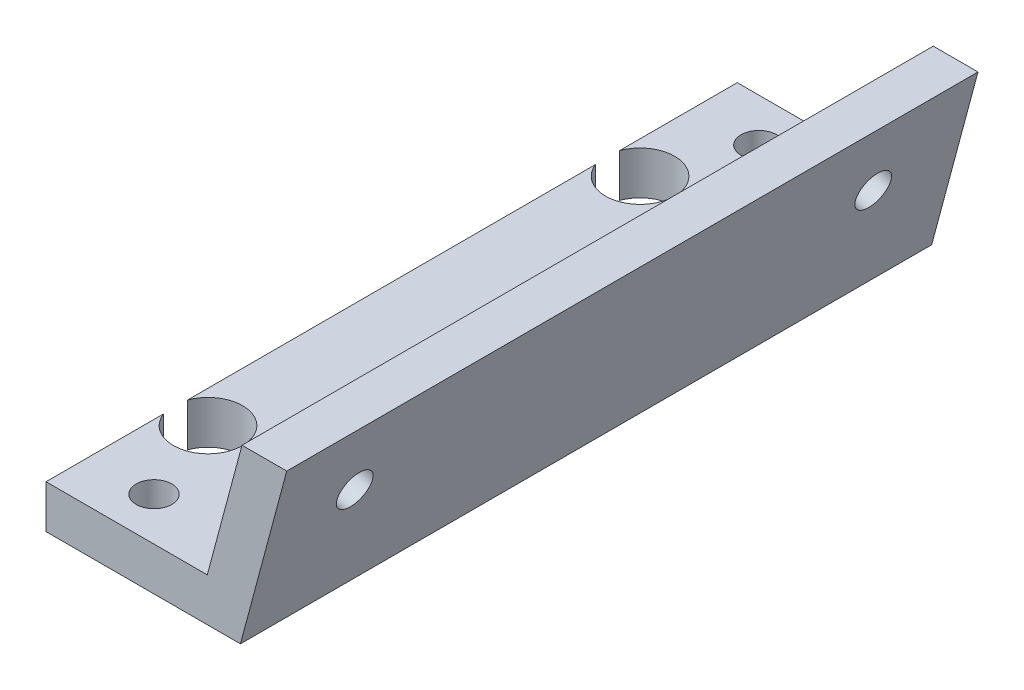
ISO-10303-21;
HEADER;
FILE_DESCRIPTION(('STEP AP214'),'2;1');
FILE_NAME('part.step','',(''),(''),'','','');
FILE_SCHEMA(('AUTOMOTIVE_DESIGN { 1 0 10303 214 1 1 1 1 }'));
ENDSEC;
DATA;
#1=APPLICATION_CONTEXT('core data for automotive mechanical design processes');
#2=APPLICATION_PROTOCOL_DEFINITION('international standard','automotive_design',2000,#1);
#3=PRODUCT_CONTEXT('',#1,'mechanical');
#4=PRODUCT('Part','Part','',(#3));
#5=PRODUCT_RELATED_PRODUCT_CATEGORY('part','',(#4));
#6=PRODUCT_DEFINITION_FORMATION('','',#4);
#7=PRODUCT_DEFINITION_CONTEXT('part definition',#1,'design');
#8=PRODUCT_DEFINITION('design','',#6,#7);
#9=PRODUCT_DEFINITION_SHAPE('','',#8);
#10=(LENGTH_UNIT() NAMED_UNIT(*) SI_UNIT(.MILLI.,.METRE.));
#11=(NAMED_UNIT(*) PLANE_ANGLE_UNIT() SI_UNIT($,.RADIAN.));
#12=(NAMED_UNIT(*) SI_UNIT($,.STERADIAN.) SOLID_ANGLE_UNIT());
#13=UNCERTAINTY_MEASURE_WITH_UNIT(LENGTH_MEASURE(1.E-05),#10,'distance_accuracy_value','');
#14=(GEOMETRIC_REPRESENTATION_CONTEXT(3) GLOBAL_UNCERTAINTY_ASSIGNED_CONTEXT((#13)) GLOBAL_UNIT_ASSIGNED_CONTEXT((#10,
#11,#12)) REPRESENTATION_CONTEXT('',''));
#15=CARTESIAN_POINT('',(0.,0.,0.));
#16=DIRECTION('',(0.,0.,1.));
#17=DIRECTION('',(1.,0.,0.));
#18=AXIS2_PLACEMENT_3D('',#15,#16,#17);
#19=CARTESIAN_POINT('',(-18.,4.,32.));
#20=DIRECTION('',(1.,0.,0.));
#21=DIRECTION('',(0.,0.,-1.));
#22=AXIS2_PLACEMENT_3D('',#19,#20,#21);
#23=PLANE('',#22);
#24=DIRECTION('',(0.,0.,-1.));
#25=VECTOR('',#24,1.);
#26=CARTESIAN_POINT('',(-18.,0.,32.));
#27=LINE('',#26,#25);
#28=CARTESIAN_POINT('',(-18.,0.,18.886447127434));
#29=VERTEX_POINT('',#28);
#30=CARTESIAN_POINT('',(-18.,0.,-18.886447127434));
#31=VERTEX_POINT('',#30);
#32=EDGE_CURVE('E125',#29,#31,#27,.T.);
#33=ORIENTED_EDGE('',*,*,#32,.F.);
#34=DIRECTION('',(0.,1.,0.));
#35=VECTOR('',#34,1.);
#36=CARTESIAN_POINT('',(-18.,-100.,18.886447127434));
#37=LINE('',#36,#35);
#38=CARTESIAN_POINT('',(-18.,4.,18.886447127434));
#39=VERTEX_POINT('',#38);
#40=EDGE_CURVE('E119',#29,#39,#37,.T.);
#41=ORIENTED_EDGE('',*,*,#40,.T.);
#42=DIRECTION('',(0.,0.,-1.));
#43=VECTOR('',#42,1.);
#44=CARTESIAN_POINT('',(-18.,4.,32.));
#45=LINE('',#44,#43);
#46=CARTESIAN_POINT('',(-18.,4.,-18.886447127434));
#47=VERTEX_POINT('',#46);
#48=EDGE_CURVE('E65',#39,#47,#45,.T.);
#49=ORIENTED_EDGE('',*,*,#48,.T.);
#50=DIRECTION('',(0.,1.,0.));
#51=VECTOR('',#50,1.);
#52=CARTESIAN_POINT('',(-18.,-100.,-18.886447127434));
#53=LINE('',#52,#51);
#54=EDGE_CURVE('E183',#47,#31,#53,.F.);
#55=ORIENTED_EDGE('',*,*,#54,.T.);
#56=EDGE_LOOP('',(#33,#41,#49,#55));
#57=FACE_BOUND('',#56,.T.);
#58=ADVANCED_FACE('F41',(#57),#23,.F.);
#59=CARTESIAN_POINT('',(-18.,0.,-21.113552872566));
#60=VERTEX_POINT('',#59);
#61=CARTESIAN_POINT('',(-18.,0.,-32.));
#62=VERTEX_POINT('',#61);
#63=EDGE_CURVE('E151',#60,#62,#27,.T.);
#64=ORIENTED_EDGE('',*,*,#63,.F.);
#65=DIRECTION('',(0.,1.,0.));
#66=VECTOR('',#65,1.);
#67=CARTESIAN_POINT('',(-18.,-100.,-21.113552872566));
#68=LINE('',#67,#66);
#69=CARTESIAN_POINT('',(-18.,4.,-21.113552872566));
#70=VERTEX_POINT('',#69);
#71=EDGE_CURVE('E185',#60,#70,#68,.T.);
#72=ORIENTED_EDGE('',*,*,#71,.T.);
#73=CARTESIAN_POINT('',(-18.,4.,-32.));
#74=VERTEX_POINT('',#73);
#75=EDGE_CURVE('E132',#70,#74,#45,.T.);
#76=ORIENTED_EDGE('',*,*,#75,.T.);
#77=DIRECTION('',(0.,-1.,0.));
#78=VECTOR('',#77,1.);
#79=CARTESIAN_POINT('',(-18.,4.,-32.));
#80=LINE('',#79,#78);
#81=EDGE_CURVE('E191',#74,#62,#80,.T.);
#82=ORIENTED_EDGE('',*,*,#81,.T.);
#83=EDGE_LOOP('',(#64,#72,#76,#82));
#84=FACE_BOUND('',#83,.T.);
#85=ADVANCED_FACE('F225',(#84),#23,.F.);
#86=CARTESIAN_POINT('',(-18.,4.,32.));
#87=VERTEX_POINT('',#86);
#88=CARTESIAN_POINT('',(-18.,4.,21.113552872566));
#89=VERTEX_POINT('',#88);
#90=EDGE_CURVE('E131',#87,#89,#45,.T.);
#91=ORIENTED_EDGE('',*,*,#90,.T.);
#92=DIRECTION('',(0.,1.,0.));
#93=VECTOR('',#92,1.);
#94=CARTESIAN_POINT('',(-18.,-100.,21.113552872566));
#95=LINE('',#94,#93);
#96=CARTESIAN_POINT('',(-18.,0.,21.113552872566));
#97=VERTEX_POINT('',#96);
#98=EDGE_CURVE('E58',#89,#97,#95,.F.);
#99=ORIENTED_EDGE('',*,*,#98,.T.);
#100=CARTESIAN_POINT('',(-18.,0.,32.));
#101=VERTEX_POINT('',#100);
#102=EDGE_CURVE('E152',#101,#97,#27,.T.);
#103=ORIENTED_EDGE('',*,*,#102,.F.);
#104=DIRECTION('',(0.,-1.,0.));
#105=VECTOR('',#104,1.);
#106=CARTESIAN_POINT('',(-18.,4.,32.));
#107=LINE('',#106,#105);
#108=EDGE_CURVE('E192',#87,#101,#107,.T.);
#109=ORIENTED_EDGE('',*,*,#108,.F.);
#110=EDGE_LOOP('',(#91,#99,#103,#109));
#111=FACE_BOUND('',#110,.T.);
#112=ADVANCED_FACE('F43',(#111),#23,.F.);
#113=CARTESIAN_POINT('',(-18.,0.,32.));
#114=DIRECTION('',(0.,1.,0.));
#115=DIRECTION('',(0.,0.,1.));
#116=AXIS2_PLACEMENT_3D('',#113,#114,#115);
#117=PLANE('',#116);
#118=CARTESIAN_POINT('',(-12.,0.,28.));
#119=DIRECTION('',(0.,1.,0.));
#120=DIRECTION('',(0.,0.,1.));
#121=AXIS2_PLACEMENT_3D('',#118,#119,#120);
#122=CIRCLE('',#121,1.65);
#123=CARTESIAN_POINT('',(-12.,0.,29.65));
#124=VERTEX_POINT('',#123);
#125=EDGE_CURVE('E160',#124,#124,#122,.T.);
#126=ORIENTED_EDGE('',*,*,#125,.T.);
#127=EDGE_LOOP('',(#126));
#128=FACE_BOUND('',#127,.T.);
#129=CARTESIAN_POINT('',(-12.,0.,-28.));
#130=DIRECTION('',(0.,1.,0.));
#131=DIRECTION('',(0.,0.,1.));
#132=AXIS2_PLACEMENT_3D('',#129,#130,#131);
#133=CIRCLE('',#132,1.65);
#134=CARTESIAN_POINT('',(-12.,0.,-26.35));
#135=VERTEX_POINT('',#134);
#136=EDGE_CURVE('E159',#135,#135,#133,.T.);
#137=ORIENTED_EDGE('',*,*,#136,.T.);
#138=EDGE_LOOP('',(#137));
#139=FACE_BOUND('',#138,.T.);
#140=ORIENTED_EDGE('',*,*,#102,.T.);
#141=CARTESIAN_POINT('',(-15.,0.,20.));
#142=DIRECTION('',(0.,1.,0.));
#143=DIRECTION('',(0.,0.,1.));
#144=AXIS2_PLACEMENT_3D('',#141,#142,#143);
#145=CIRCLE('',#144,3.2);
#146=EDGE_CURVE('E126',#97,#29,#145,.T.);
#147=ORIENTED_EDGE('',*,*,#146,.T.);
#148=ORIENTED_EDGE('',*,*,#32,.T.);
#149=CARTESIAN_POINT('',(-15.,0.,-20.));
#150=DIRECTION('',(0.,1.,0.));
#151=DIRECTION('',(0.,0.,1.));
#152=AXIS2_PLACEMENT_3D('',#149,#150,#151);
#153=CIRCLE('',#152,3.2);
#154=EDGE_CURVE('E188',#31,#60,#153,.T.);
#155=ORIENTED_EDGE('',*,*,#154,.T.);
#156=ORIENTED_EDGE('',*,*,#63,.T.);
#157=DIRECTION('',(1.,0.,0.));
#158=VECTOR('',#157,1.);
#159=CARTESIAN_POINT('',(-18.,0.,-32.));
#160=LINE('',#159,#158);
#161=CARTESIAN_POINT('',(0.,0.,-32.));
#162=VERTEX_POINT('',#161);
#163=EDGE_CURVE('E206',#62,#162,#160,.T.);
#164=ORIENTED_EDGE('',*,*,#163,.T.);
#165=DIRECTION('',(0.,0.,-1.));
#166=VECTOR('',#165,1.);
#167=CARTESIAN_POINT('',(0.,0.,32.));
#168=LINE('',#167,#166);
#169=CARTESIAN_POINT('',(0.,0.,32.));
#170=VERTEX_POINT('',#169);
#171=EDGE_CURVE('E148',#170,#162,#168,.T.);
#172=ORIENTED_EDGE('',*,*,#171,.F.);
#173=DIRECTION('',(1.,0.,0.));
#174=VECTOR('',#173,1.);
#175=CARTESIAN_POINT('',(-18.,0.,32.));
#176=LINE('',#175,#174);
#177=EDGE_CURVE('E195',#101,#170,#176,.T.);
#178=ORIENTED_EDGE('',*,*,#177,.F.);
#179=EDGE_LOOP('',(#140,#147,#148,#155,#156,#164,#172,#178));
#180=FACE_BOUND('',#179,.T.);
#181=ADVANCED_FACE('F230',(#128,#139,#180),#117,.F.);
#182=CARTESIAN_POINT('',(0.,0.,32.));
#183=DIRECTION('',(-0.965925826289068,0.258819045102521,0.));
#184=DIRECTION('',(-0.258819045102521,-0.965925826289068,0.));
#185=AXIS2_PLACEMENT_3D('',#182,#183,#184);
#186=PLANE('',#185);
#187=CARTESIAN_POINT('',(2.58819045102521,9.65925826289068,-24.));
#188=DIRECTION('',(-0.965925826289068,0.258819045102521,0.));
#189=DIRECTION('',(-0.258819045102521,-0.965925826289068,0.));
#190=AXIS2_PLACEMENT_3D('',#187,#188,#189);
#191=CIRCLE('',#190,1.65);
#192=CARTESIAN_POINT('',(2.16113902660605,8.06548064951372,-24.));
#193=VERTEX_POINT('',#192);
#194=EDGE_CURVE('E163',#193,#193,#191,.T.);
#195=ORIENTED_EDGE('',*,*,#194,.T.);
#196=EDGE_LOOP('',(#195));
#197=FACE_BOUND('',#196,.T.);
#198=CARTESIAN_POINT('',(2.58819045102521,9.65925826289068,24.));
#199=DIRECTION('',(-0.965925826289068,0.258819045102521,0.));
#200=DIRECTION('',(-0.258819045102521,-0.965925826289068,0.));
#201=AXIS2_PLACEMENT_3D('',#198,#199,#200);
#202=CIRCLE('',#201,1.65);
#203=CARTESIAN_POINT('',(2.16113902660605,8.06548064951372,24.));
#204=VERTEX_POINT('',#203);
#205=EDGE_CURVE('E166',#204,#204,#202,.T.);
#206=ORIENTED_EDGE('',*,*,#205,.T.);
#207=EDGE_LOOP('',(#206));
#208=FACE_BOUND('',#207,.T.);
#209=DIRECTION('',(0.258819045102521,0.965925826289068,0.));
#210=VECTOR('',#209,1.);
#211=CARTESIAN_POINT('',(0.,0.,-32.));
#212=LINE('',#211,#210);
#213=CARTESIAN_POINT('',(4.28718707889796,16.,-32.));
#214=VERTEX_POINT('',#213);
#215=EDGE_CURVE('E208',#162,#214,#212,.T.);
#216=ORIENTED_EDGE('',*,*,#215,.T.);
#217=DIRECTION('',(0.,0.,-1.));
#218=VECTOR('',#217,1.);
#219=CARTESIAN_POINT('',(4.28718707889796,16.,32.));
#220=LINE('',#219,#218);
#221=CARTESIAN_POINT('',(4.28718707889796,16.,32.));
#222=VERTEX_POINT('',#221);
#223=EDGE_CURVE('E145',#222,#214,#220,.T.);
#224=ORIENTED_EDGE('',*,*,#223,.F.);
#225=DIRECTION('',(0.258819045102521,0.965925826289068,0.));
#226=VECTOR('',#225,1.);
#227=CARTESIAN_POINT('',(0.,0.,32.));
#228=LINE('',#227,#226);
#229=EDGE_CURVE('E197',#170,#222,#228,.T.);
#230=ORIENTED_EDGE('',*,*,#229,.F.);
#231=ORIENTED_EDGE('',*,*,#171,.T.);
#232=EDGE_LOOP('',(#216,#224,#230,#231));
#233=FACE_BOUND('',#232,.T.);
#234=ADVANCED_FACE('F250',(#197,#208,#233),#186,.F.);
#235=CARTESIAN_POINT('',(4.28718707889796,16.,32.));
#236=DIRECTION('',(0.,-1.,0.));
#237=DIRECTION('',(0.,0.,-1.));
#238=AXIS2_PLACEMENT_3D('',#235,#236,#237);
#239=PLANE('',#238);
#240=DIRECTION('',(-1.,0.,0.));
#241=VECTOR('',#240,1.);
#242=CARTESIAN_POINT('',(4.28718707889796,16.,-32.));
#243=LINE('',#242,#241);
#244=CARTESIAN_POINT('',(0.146082357257631,16.,-32.));
#245=VERTEX_POINT('',#244);
#246=EDGE_CURVE('E210',#214,#245,#243,.T.);
#247=ORIENTED_EDGE('',*,*,#246,.T.);
#248=DIRECTION('',(0.,0.,-1.));
#249=VECTOR('',#248,1.);
#250=CARTESIAN_POINT('',(0.146082357257631,16.,32.));
#251=LINE('',#250,#249);
#252=CARTESIAN_POINT('',(0.146082357257631,16.,32.));
#253=VERTEX_POINT('',#252);
#254=EDGE_CURVE('E142',#253,#245,#251,.T.);
#255=ORIENTED_EDGE('',*,*,#254,.F.);
#256=DIRECTION('',(-1.,0.,0.));
#257=VECTOR('',#256,1.);
#258=CARTESIAN_POINT('',(4.28718707889796,16.,32.));
#259=LINE('',#258,#257);
#260=EDGE_CURVE('E199',#222,#253,#259,.T.);
#261=ORIENTED_EDGE('',*,*,#260,.F.);
#262=ORIENTED_EDGE('',*,*,#223,.T.);
#263=EDGE_LOOP('',(#247,#255,#261,#262));
#264=FACE_BOUND('',#263,.T.);
#265=ADVANCED_FACE('F241',(#264),#239,.F.);
#266=CARTESIAN_POINT('',(0.146082357257631,16.,32.));
#267=DIRECTION('',(0.965925826289068,-0.258819045102521,0.));
#268=DIRECTION('',(0.258819045102521,0.965925826289068,0.));
#269=AXIS2_PLACEMENT_3D('',#266,#267,#268);
#270=PLANE('',#269);
#271=CARTESIAN_POINT('',(-1.27551285413106,10.6945344433008,-24.));
#272=DIRECTION('',(0.965925826289068,-0.258819045102521,0.));
#273=DIRECTION('',(0.258819045102521,0.965925826289068,0.));
#274=AXIS2_PLACEMENT_3D('',#271,#272,#273);
#275=CIRCLE('',#274,1.65);
#276=CARTESIAN_POINT('',(-0.848461429711906,12.2883120566777,-24.));
#277=VERTEX_POINT('',#276);
#278=EDGE_CURVE('E45',#277,#277,#275,.T.);
#279=ORIENTED_EDGE('',*,*,#278,.T.);
#280=EDGE_LOOP('',(#279));
#281=FACE_BOUND('',#280,.T.);
#282=CARTESIAN_POINT('',(-1.27551285413106,10.6945344433008,24.));
#283=DIRECTION('',(0.965925826289068,-0.258819045102521,0.));
#284=DIRECTION('',(0.258819045102521,0.965925826289068,0.));
#285=AXIS2_PLACEMENT_3D('',#282,#283,#284);
#286=CIRCLE('',#285,1.65);
#287=CARTESIAN_POINT('',(-0.848461429711906,12.2883120566777,24.));
#288=VERTEX_POINT('',#287);
#289=EDGE_CURVE('E164',#288,#288,#286,.T.);
#290=ORIENTED_EDGE('',*,*,#289,.T.);
#291=EDGE_LOOP('',(#290));
#292=FACE_BOUND('',#291,.T.);
#293=DIRECTION('',(-0.258819045102521,-0.965925826289068,0.));
#294=VECTOR('',#293,1.);
#295=CARTESIAN_POINT('',(0.146082357257631,16.,-32.));
#296=LINE('',#295,#294);
#297=CARTESIAN_POINT('',(-3.06930795191584,4.,-32.));
#298=VERTEX_POINT('',#297);
#299=EDGE_CURVE('E211',#245,#298,#296,.T.);
#300=ORIENTED_EDGE('',*,*,#299,.T.);
#301=DIRECTION('',(0.,0.,-1.));
#302=VECTOR('',#301,1.);
#303=CARTESIAN_POINT('',(-3.06930795191584,4.,32.));
#304=LINE('',#303,#302);
#305=CARTESIAN_POINT('',(-3.06930795191584,4.,32.));
#306=VERTEX_POINT('',#305);
#307=EDGE_CURVE('E134',#306,#298,#304,.T.);
#308=ORIENTED_EDGE('',*,*,#307,.F.);
#309=DIRECTION('',(-0.258819045102521,-0.965925826289068,0.));
#310=VECTOR('',#309,1.);
#311=CARTESIAN_POINT('',(0.146082357257631,16.,32.));
#312=LINE('',#311,#310);
#313=EDGE_CURVE('E201',#253,#306,#312,.T.);
#314=ORIENTED_EDGE('',*,*,#313,.F.);
#315=ORIENTED_EDGE('',*,*,#254,.T.);
#316=EDGE_LOOP('',(#300,#308,#314,#315));
#317=FACE_BOUND('',#316,.T.);
#318=ADVANCED_FACE('F239',(#281,#292,#317),#270,.F.);
#319=CARTESIAN_POINT('',(-3.06930795191584,4.,32.));
#320=DIRECTION('',(0.,-1.,0.));
#321=DIRECTION('',(0.,0.,-1.));
#322=AXIS2_PLACEMENT_3D('',#319,#320,#321);
#323=PLANE('',#322);
#324=CARTESIAN_POINT('',(-12.,4.,28.));
#325=DIRECTION('',(0.,-1.,0.));
#326=DIRECTION('',(0.,0.,-1.));
#327=AXIS2_PLACEMENT_3D('',#324,#325,#326);
#328=CIRCLE('',#327,1.65);
#329=CARTESIAN_POINT('',(-12.,4.,26.35));
#330=VERTEX_POINT('',#329);
#331=EDGE_CURVE('E161',#330,#330,#328,.T.);
#332=ORIENTED_EDGE('',*,*,#331,.T.);
#333=EDGE_LOOP('',(#332));
#334=FACE_BOUND('',#333,.T.);
#335=CARTESIAN_POINT('',(-12.,4.,-28.));
#336=DIRECTION('',(0.,-1.,0.));
#337=DIRECTION('',(0.,0.,-1.));
#338=AXIS2_PLACEMENT_3D('',#335,#336,#337);
#339=CIRCLE('',#338,1.65);
#340=CARTESIAN_POINT('',(-12.,4.,-29.65));
#341=VERTEX_POINT('',#340);
#342=EDGE_CURVE('E156',#341,#341,#339,.T.);
#343=ORIENTED_EDGE('',*,*,#342,.T.);
#344=EDGE_LOOP('',(#343));
#345=FACE_BOUND('',#344,.T.);
#346=ORIENTED_EDGE('',*,*,#48,.F.);
#347=CARTESIAN_POINT('',(-15.,4.,20.));
#348=DIRECTION('',(0.,-1.,0.));
#349=DIRECTION('',(0.,0.,-1.));
#350=AXIS2_PLACEMENT_3D('',#347,#348,#349);
#351=CIRCLE('',#350,3.2);
#352=EDGE_CURVE('E11',#39,#89,#351,.T.);
#353=ORIENTED_EDGE('',*,*,#352,.T.);
#354=ORIENTED_EDGE('',*,*,#90,.F.);
#355=DIRECTION('',(-1.,0.,0.));
#356=VECTOR('',#355,1.);
#357=CARTESIAN_POINT('',(-3.06930795191584,4.,32.));
#358=LINE('',#357,#356);
#359=EDGE_CURVE('E135',#306,#87,#358,.T.);
#360=ORIENTED_EDGE('',*,*,#359,.F.);
#361=ORIENTED_EDGE('',*,*,#307,.T.);
#362=DIRECTION('',(-1.,0.,0.));
#363=VECTOR('',#362,1.);
#364=CARTESIAN_POINT('',(-3.06930795191584,4.,-32.));
#365=LINE('',#364,#363);
#366=EDGE_CURVE('E138',#298,#74,#365,.T.);
#367=ORIENTED_EDGE('',*,*,#366,.T.);
#368=ORIENTED_EDGE('',*,*,#75,.F.);
#369=CARTESIAN_POINT('',(-15.,4.,-20.));
#370=DIRECTION('',(0.,-1.,0.));
#371=DIRECTION('',(0.,0.,-1.));
#372=AXIS2_PLACEMENT_3D('',#369,#370,#371);
#373=CIRCLE('',#372,3.2);
#374=EDGE_CURVE('E50',#70,#47,#373,.T.);
#375=ORIENTED_EDGE('',*,*,#374,.T.);
#376=EDGE_LOOP('',(#346,#353,#354,#360,#361,#367,#368,#375));
#377=FACE_BOUND('',#376,.T.);
#378=ADVANCED_FACE('F129',(#334,#345,#377),#323,.F.);
#379=CARTESIAN_POINT('',(0.,0.,32.));
#380=DIRECTION('',(0.,0.,1.));
#381=DIRECTION('',(1.,0.,0.));
#382=AXIS2_PLACEMENT_3D('',#379,#380,#381);
#383=PLANE('',#382);
#384=ORIENTED_EDGE('',*,*,#108,.T.);
#385=ORIENTED_EDGE('',*,*,#177,.T.);
#386=ORIENTED_EDGE('',*,*,#229,.T.);
#387=ORIENTED_EDGE('',*,*,#260,.T.);
#388=ORIENTED_EDGE('',*,*,#313,.T.);
#389=ORIENTED_EDGE('',*,*,#359,.T.);
#390=EDGE_LOOP('',(#384,#385,#386,#387,#388,#389));
#391=FACE_BOUND('',#390,.T.);
#392=ADVANCED_FACE('F235',(#391),#383,.T.);
#393=CARTESIAN_POINT('',(0.,0.,-32.));
#394=DIRECTION('',(0.,0.,1.));
#395=DIRECTION('',(1.,0.,0.));
#396=AXIS2_PLACEMENT_3D('',#393,#394,#395);
#397=PLANE('',#396);
#398=ORIENTED_EDGE('',*,*,#81,.F.);
#399=ORIENTED_EDGE('',*,*,#366,.F.);
#400=ORIENTED_EDGE('',*,*,#299,.F.);
#401=ORIENTED_EDGE('',*,*,#246,.F.);
#402=ORIENTED_EDGE('',*,*,#215,.F.);
#403=ORIENTED_EDGE('',*,*,#163,.F.);
#404=EDGE_LOOP('',(#398,#399,#400,#401,#402,#403));
#405=FACE_BOUND('',#404,.T.);
#406=ADVANCED_FACE('F221',(#405),#397,.F.);
#407=CARTESIAN_POINT('',(-15.,-100.,-20.));
#408=DIRECTION('',(0.,1.,0.));
#409=DIRECTION('',(0.,0.,1.));
#410=AXIS2_PLACEMENT_3D('',#407,#408,#409);
#411=CYLINDRICAL_SURFACE('',#410,3.2);
#412=ORIENTED_EDGE('',*,*,#54,.F.);
#413=ORIENTED_EDGE('',*,*,#374,.F.);
#414=ORIENTED_EDGE('',*,*,#71,.F.);
#415=ORIENTED_EDGE('',*,*,#154,.F.);
#416=EDGE_LOOP('',(#412,#413,#414,#415));
#417=FACE_BOUND('',#416,.T.);
#418=ADVANCED_FACE('F228',(#417),#411,.F.);
#419=CARTESIAN_POINT('',(-15.,-100.,20.));
#420=DIRECTION('',(0.,1.,0.));
#421=DIRECTION('',(0.,0.,1.));
#422=AXIS2_PLACEMENT_3D('',#419,#420,#421);
#423=CYLINDRICAL_SURFACE('',#422,3.2);
#424=ORIENTED_EDGE('',*,*,#98,.F.);
#425=ORIENTED_EDGE('',*,*,#352,.F.);
#426=ORIENTED_EDGE('',*,*,#40,.F.);
#427=ORIENTED_EDGE('',*,*,#146,.F.);
#428=EDGE_LOOP('',(#424,#425,#426,#427));
#429=FACE_BOUND('',#428,.T.);
#430=ADVANCED_FACE('F118',(#429),#423,.F.);
#431=CARTESIAN_POINT('',(-12.,-100.,-28.));
#432=DIRECTION('',(0.,1.,0.));
#433=DIRECTION('',(0.,0.,1.));
#434=AXIS2_PLACEMENT_3D('',#431,#432,#433);
#435=CYLINDRICAL_SURFACE('',#434,1.65);
#436=ORIENTED_EDGE('',*,*,#342,.F.);
#437=EDGE_LOOP('',(#436));
#438=FACE_BOUND('',#437,.T.);
#439=ORIENTED_EDGE('',*,*,#136,.F.);
#440=EDGE_LOOP('',(#439));
#441=FACE_BOUND('',#440,.T.);
#442=ADVANCED_FACE('F271',(#438,#441),#435,.F.);
#443=CARTESIAN_POINT('',(-12.,-100.,28.));
#444=DIRECTION('',(0.,1.,0.));
#445=DIRECTION('',(0.,0.,1.));
#446=AXIS2_PLACEMENT_3D('',#443,#444,#445);
#447=CYLINDRICAL_SURFACE('',#446,1.65);
#448=ORIENTED_EDGE('',*,*,#331,.F.);
#449=EDGE_LOOP('',(#448));
#450=FACE_BOUND('',#449,.T.);
#451=ORIENTED_EDGE('',*,*,#125,.F.);
#452=EDGE_LOOP('',(#451));
#453=FACE_BOUND('',#452,.T.);
#454=ADVANCED_FACE('F273',(#450,#453),#447,.F.);
#455=CARTESIAN_POINT('',(-9.00291946444361,12.7650868041209,24.));
#456=DIRECTION('',(0.965925826289068,-0.258819045102521,0.));
#457=DIRECTION('',(0.258819045102521,0.965925826289068,0.));
#458=AXIS2_PLACEMENT_3D('',#455,#456,#457);
#459=CYLINDRICAL_SURFACE('',#458,1.65);
#460=ORIENTED_EDGE('',*,*,#289,.F.);
#461=EDGE_LOOP('',(#460));
#462=FACE_BOUND('',#461,.T.);
#463=ORIENTED_EDGE('',*,*,#205,.F.);
#464=EDGE_LOOP('',(#463));
#465=FACE_BOUND('',#464,.T.);
#466=ADVANCED_FACE('F280',(#462,#465),#459,.F.);
#467=CARTESIAN_POINT('',(-9.00291946444361,12.7650868041209,-24.));
#468=DIRECTION('',(0.965925826289068,-0.258819045102521,0.));
#469=DIRECTION('',(0.258819045102521,0.965925826289068,0.));
#470=AXIS2_PLACEMENT_3D('',#467,#468,#469);
#471=CYLINDRICAL_SURFACE('',#470,1.65);
#472=ORIENTED_EDGE('',*,*,#278,.F.);
#473=EDGE_LOOP('',(#472));
#474=FACE_BOUND('',#473,.T.);
#475=ORIENTED_EDGE('',*,*,#194,.F.);
#476=EDGE_LOOP('',(#475));
#477=FACE_BOUND('',#476,.T.);
#478=ADVANCED_FACE('F356',(#474,#477),#471,.F.);
#479=CLOSED_SHELL('',(#58,#85,#112,#181,#234,#265,#318,#378,#392,#406,#418,#430,#442,#454,#466,#478));
#480=MANIFOLD_SOLID_BREP('B2',#479);
#481=ADVANCED_BREP_SHAPE_REPRESENTATION('',(#18,#480),#14);
#482=SHAPE_DEFINITION_REPRESENTATION(#9,#481);
ENDSEC;
END-ISO-10303-21;
